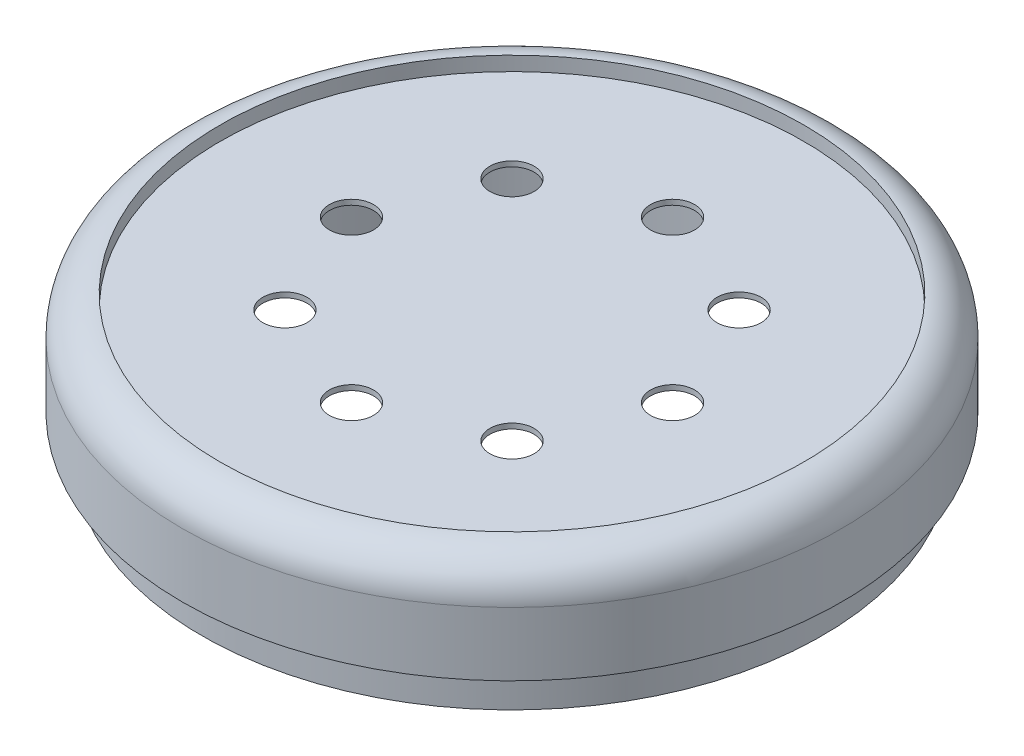
ISO-10303-21;
HEADER;
FILE_DESCRIPTION(('STEP AP214'),'2;1');
FILE_NAME('part.step','',(''),(''),'','','');
FILE_SCHEMA(('AUTOMOTIVE_DESIGN { 1 0 10303 214 1 1 1 1 }'));
ENDSEC;
DATA;
#1=APPLICATION_CONTEXT('core data for automotive mechanical design processes');
#2=APPLICATION_PROTOCOL_DEFINITION('international standard','automotive_design',2000,#1);
#3=PRODUCT_CONTEXT('',#1,'mechanical');
#4=PRODUCT('Part','Part','',(#3));
#5=PRODUCT_RELATED_PRODUCT_CATEGORY('part','',(#4));
#6=PRODUCT_DEFINITION_FORMATION('','',#4);
#7=PRODUCT_DEFINITION_CONTEXT('part definition',#1,'design');
#8=PRODUCT_DEFINITION('design','',#6,#7);
#9=PRODUCT_DEFINITION_SHAPE('','',#8);
#10=(LENGTH_UNIT() NAMED_UNIT(*) SI_UNIT(.MILLI.,.METRE.));
#11=(NAMED_UNIT(*) PLANE_ANGLE_UNIT() SI_UNIT($,.RADIAN.));
#12=(NAMED_UNIT(*) SI_UNIT($,.STERADIAN.) SOLID_ANGLE_UNIT());
#13=UNCERTAINTY_MEASURE_WITH_UNIT(LENGTH_MEASURE(1.E-05),#10,'distance_accuracy_value','');
#14=(GEOMETRIC_REPRESENTATION_CONTEXT(3) GLOBAL_UNCERTAINTY_ASSIGNED_CONTEXT((#13)) GLOBAL_UNIT_ASSIGNED_CONTEXT((#10,
#11,#12)) REPRESENTATION_CONTEXT('',''));
#15=CARTESIAN_POINT('',(0.,0.,0.));
#16=DIRECTION('',(0.,0.,1.));
#17=DIRECTION('',(1.,0.,0.));
#18=AXIS2_PLACEMENT_3D('',#15,#16,#17);
#19=CARTESIAN_POINT('',(-8.75088716452987,0.,-8.7508871645295));
#20=DIRECTION('',(0.,1.,0.));
#21=DIRECTION('',(0.,0.,1.));
#22=AXIS2_PLACEMENT_3D('',#19,#20,#21);
#23=CYLINDRICAL_SURFACE('',#22,1.70000000000057);
#24=CARTESIAN_POINT('',(-8.75088716452987,9.4,-8.7508871645295));
#25=DIRECTION('',(0.,1.,0.));
#26=DIRECTION('',(0.,0.,1.));
#27=AXIS2_PLACEMENT_3D('',#24,#25,#26);
#28=CIRCLE('',#27,1.70000000000057);
#29=CARTESIAN_POINT('',(-8.75088716452987,9.4,-7.05088716452893));
#30=VERTEX_POINT('',#29);
#31=EDGE_CURVE('E84',#30,#30,#28,.T.);
#32=ORIENTED_EDGE('',*,*,#31,.F.);
#33=EDGE_LOOP('',(#32));
#34=FACE_BOUND('',#33,.T.);
#35=CARTESIAN_POINT('',(-8.75088716452987,9.8,-8.7508871645295));
#36=DIRECTION('',(0.,1.,0.));
#37=DIRECTION('',(0.,0.,1.));
#38=AXIS2_PLACEMENT_3D('',#35,#36,#37);
#39=CIRCLE('',#38,1.70000000000057);
#40=CARTESIAN_POINT('',(-8.75088716452987,9.8,-7.05088716452893));
#41=VERTEX_POINT('',#40);
#42=EDGE_CURVE('E81',#41,#41,#39,.F.);
#43=ORIENTED_EDGE('',*,*,#42,.F.);
#44=EDGE_LOOP('',(#43));
#45=FACE_BOUND('',#44,.T.);
#46=ADVANCED_FACE('F34',(#34,#45),#23,.F.);
#47=CARTESIAN_POINT('',(-12.3756233108743,0.,8.78583136030813E-13));
#48=DIRECTION('',(0.,1.,0.));
#49=DIRECTION('',(0.,0.,1.));
#50=AXIS2_PLACEMENT_3D('',#47,#48,#49);
#51=CYLINDRICAL_SURFACE('',#50,1.70000000000122);
#52=CARTESIAN_POINT('',(-12.3756233108743,9.4,8.78583136030813E-13));
#53=DIRECTION('',(0.,1.,0.));
#54=DIRECTION('',(0.,0.,1.));
#55=AXIS2_PLACEMENT_3D('',#52,#53,#54);
#56=CIRCLE('',#55,1.70000000000122);
#57=CARTESIAN_POINT('',(-12.3756233108743,9.4,1.7000000000021));
#58=VERTEX_POINT('',#57);
#59=EDGE_CURVE('E104',#58,#58,#56,.T.);
#60=ORIENTED_EDGE('',*,*,#59,.F.);
#61=EDGE_LOOP('',(#60));
#62=FACE_BOUND('',#61,.T.);
#63=CARTESIAN_POINT('',(-12.3756233108743,9.8,8.78583136030813E-13));
#64=DIRECTION('',(0.,1.,0.));
#65=DIRECTION('',(0.,0.,1.));
#66=AXIS2_PLACEMENT_3D('',#63,#64,#65);
#67=CIRCLE('',#66,1.70000000000122);
#68=CARTESIAN_POINT('',(-12.3756233108743,9.8,1.7000000000021));
#69=VERTEX_POINT('',#68);
#70=EDGE_CURVE('E78',#69,#69,#67,.F.);
#71=ORIENTED_EDGE('',*,*,#70,.F.);
#72=EDGE_LOOP('',(#71));
#73=FACE_BOUND('',#72,.T.);
#74=ADVANCED_FACE('F155',(#62,#73),#51,.F.);
#75=CARTESIAN_POINT('',(-8.75088716452863,0.,8.75088716453075));
#76=DIRECTION('',(0.,1.,0.));
#77=DIRECTION('',(0.,0.,1.));
#78=AXIS2_PLACEMENT_3D('',#75,#76,#77);
#79=CYLINDRICAL_SURFACE('',#78,1.70000000000171);
#80=CARTESIAN_POINT('',(-8.75088716452863,9.4,8.75088716453075));
#81=DIRECTION('',(0.,1.,0.));
#82=DIRECTION('',(0.,0.,1.));
#83=AXIS2_PLACEMENT_3D('',#80,#81,#82);
#84=CIRCLE('',#83,1.70000000000171);
#85=CARTESIAN_POINT('',(-8.75088716452863,9.4,10.4508871645325));
#86=VERTEX_POINT('',#85);
#87=EDGE_CURVE('E107',#86,#86,#84,.T.);
#88=ORIENTED_EDGE('',*,*,#87,.F.);
#89=EDGE_LOOP('',(#88));
#90=FACE_BOUND('',#89,.T.);
#91=CARTESIAN_POINT('',(-8.75088716452863,9.8,8.75088716453075));
#92=DIRECTION('',(0.,1.,0.));
#93=DIRECTION('',(0.,0.,1.));
#94=AXIS2_PLACEMENT_3D('',#91,#92,#93);
#95=CIRCLE('',#94,1.70000000000171);
#96=CARTESIAN_POINT('',(-8.75088716452863,9.8,10.4508871645325));
#97=VERTEX_POINT('',#96);
#98=EDGE_CURVE('E75',#97,#97,#95,.F.);
#99=ORIENTED_EDGE('',*,*,#98,.F.);
#100=EDGE_LOOP('',(#99));
#101=FACE_BOUND('',#100,.T.);
#102=ADVANCED_FACE('F161',(#90,#101),#79,.F.);
#103=CARTESIAN_POINT('',(1.7541351185666E-12,0.,12.3756233108751));
#104=DIRECTION('',(0.,1.,0.));
#105=DIRECTION('',(0.,0.,1.));
#106=AXIS2_PLACEMENT_3D('',#103,#104,#105);
#107=CYLINDRICAL_SURFACE('',#106,1.70000000000176);
#108=CARTESIAN_POINT('',(1.7541351185666E-12,9.4,12.3756233108751));
#109=DIRECTION('',(0.,1.,0.));
#110=DIRECTION('',(0.,0.,1.));
#111=AXIS2_PLACEMENT_3D('',#108,#109,#110);
#112=CIRCLE('',#111,1.70000000000176);
#113=CARTESIAN_POINT('',(1.7541351185666E-12,9.4,14.0756233108769));
#114=VERTEX_POINT('',#113);
#115=EDGE_CURVE('E110',#114,#114,#112,.T.);
#116=ORIENTED_EDGE('',*,*,#115,.F.);
#117=EDGE_LOOP('',(#116));
#118=FACE_BOUND('',#117,.T.);
#119=CARTESIAN_POINT('',(1.7541351185666E-12,9.8,12.3756233108751));
#120=DIRECTION('',(0.,1.,0.));
#121=DIRECTION('',(0.,0.,1.));
#122=AXIS2_PLACEMENT_3D('',#119,#120,#121);
#123=CIRCLE('',#122,1.70000000000176);
#124=CARTESIAN_POINT('',(1.7541351185666E-12,9.8,14.0756233108769));
#125=VERTEX_POINT('',#124);
#126=EDGE_CURVE('E72',#125,#125,#123,.F.);
#127=ORIENTED_EDGE('',*,*,#126,.F.);
#128=EDGE_LOOP('',(#127));
#129=FACE_BOUND('',#128,.T.);
#130=ADVANCED_FACE('F266',(#118,#129),#107,.F.);
#131=CARTESIAN_POINT('',(8.75088716453162,0.,8.75088716452951));
#132=DIRECTION('',(0.,1.,0.));
#133=DIRECTION('',(0.,0.,1.));
#134=AXIS2_PLACEMENT_3D('',#131,#132,#133);
#135=CYLINDRICAL_SURFACE('',#134,1.70000000000131);
#136=CARTESIAN_POINT('',(8.75088716453162,9.4,8.75088716452951));
#137=DIRECTION('',(0.,1.,0.));
#138=DIRECTION('',(0.,0.,1.));
#139=AXIS2_PLACEMENT_3D('',#136,#137,#138);
#140=CIRCLE('',#139,1.70000000000131);
#141=CARTESIAN_POINT('',(8.75088716453162,9.4,10.4508871645308));
#142=VERTEX_POINT('',#141);
#143=EDGE_CURVE('E113',#142,#142,#140,.T.);
#144=ORIENTED_EDGE('',*,*,#143,.F.);
#145=EDGE_LOOP('',(#144));
#146=FACE_BOUND('',#145,.T.);
#147=CARTESIAN_POINT('',(8.75088716453162,9.8,8.75088716452951));
#148=DIRECTION('',(0.,1.,0.));
#149=DIRECTION('',(0.,0.,1.));
#150=AXIS2_PLACEMENT_3D('',#147,#148,#149);
#151=CIRCLE('',#150,1.70000000000131);
#152=CARTESIAN_POINT('',(8.75088716453162,9.8,10.4508871645308));
#153=VERTEX_POINT('',#152);
#154=EDGE_CURVE('E69',#153,#153,#151,.F.);
#155=ORIENTED_EDGE('',*,*,#154,.F.);
#156=EDGE_LOOP('',(#155));
#157=FACE_BOUND('',#156,.T.);
#158=ADVANCED_FACE('F274',(#146,#157),#135,.F.);
#159=CARTESIAN_POINT('',(12.375623310876,0.,-8.77067559283302E-13));
#160=DIRECTION('',(0.,1.,0.));
#161=DIRECTION('',(0.,0.,1.));
#162=AXIS2_PLACEMENT_3D('',#159,#160,#161);
#163=CYLINDRICAL_SURFACE('',#162,1.70000000000062);
#164=CARTESIAN_POINT('',(12.375623310876,9.4,-8.77067559283302E-13));
#165=DIRECTION('',(0.,1.,0.));
#166=DIRECTION('',(0.,0.,1.));
#167=AXIS2_PLACEMENT_3D('',#164,#165,#166);
#168=CIRCLE('',#167,1.70000000000062);
#169=CARTESIAN_POINT('',(12.375623310876,9.4,1.69999999999975));
#170=VERTEX_POINT('',#169);
#171=EDGE_CURVE('E116',#170,#170,#168,.T.);
#172=ORIENTED_EDGE('',*,*,#171,.F.);
#173=EDGE_LOOP('',(#172));
#174=FACE_BOUND('',#173,.T.);
#175=CARTESIAN_POINT('',(12.375623310876,9.8,-8.77067559283302E-13));
#176=DIRECTION('',(0.,1.,0.));
#177=DIRECTION('',(0.,0.,1.));
#178=AXIS2_PLACEMENT_3D('',#175,#176,#177);
#179=CIRCLE('',#178,1.70000000000062);
#180=CARTESIAN_POINT('',(12.375623310876,9.8,1.69999999999975));
#181=VERTEX_POINT('',#180);
#182=EDGE_CURVE('E66',#181,#181,#179,.F.);
#183=ORIENTED_EDGE('',*,*,#182,.F.);
#184=EDGE_LOOP('',(#183));
#185=FACE_BOUND('',#184,.T.);
#186=ADVANCED_FACE('F283',(#174,#185),#163,.F.);
#187=CARTESIAN_POINT('',(8.75088716453038,0.,-8.75088716453074));
#188=DIRECTION('',(0.,1.,0.));
#189=DIRECTION('',(0.,0.,1.));
#190=AXIS2_PLACEMENT_3D('',#187,#188,#189);
#191=CYLINDRICAL_SURFACE('',#190,1.70000000000008);
#192=CARTESIAN_POINT('',(8.75088716453038,9.4,-8.75088716453074));
#193=DIRECTION('',(0.,1.,0.));
#194=DIRECTION('',(0.,0.,1.));
#195=AXIS2_PLACEMENT_3D('',#192,#193,#194);
#196=CIRCLE('',#195,1.70000000000008);
#197=CARTESIAN_POINT('',(8.75088716453038,9.4,-7.05088716453066));
#198=VERTEX_POINT('',#197);
#199=EDGE_CURVE('E118',#198,#198,#196,.T.);
#200=ORIENTED_EDGE('',*,*,#199,.F.);
#201=EDGE_LOOP('',(#200));
#202=FACE_BOUND('',#201,.T.);
#203=CARTESIAN_POINT('',(8.75088716453038,9.8,-8.75088716453074));
#204=DIRECTION('',(0.,1.,0.));
#205=DIRECTION('',(0.,0.,1.));
#206=AXIS2_PLACEMENT_3D('',#203,#204,#205);
#207=CIRCLE('',#206,1.70000000000008);
#208=CARTESIAN_POINT('',(8.75088716453038,9.8,-7.05088716453066));
#209=VERTEX_POINT('',#208);
#210=EDGE_CURVE('E58',#209,#209,#207,.F.);
#211=ORIENTED_EDGE('',*,*,#210,.F.);
#212=EDGE_LOOP('',(#211));
#213=FACE_BOUND('',#212,.T.);
#214=ADVANCED_FACE('F131',(#202,#213),#191,.F.);
#215=CARTESIAN_POINT('',(0.,0.,-12.3756233108751));
#216=DIRECTION('',(0.,1.,0.));
#217=DIRECTION('',(0.,0.,1.));
#218=AXIS2_PLACEMENT_3D('',#215,#216,#217);
#219=CYLINDRICAL_SURFACE('',#218,1.7);
#220=CARTESIAN_POINT('',(0.,9.4,-12.3756233108751));
#221=DIRECTION('',(0.,1.,0.));
#222=DIRECTION('',(0.,0.,1.));
#223=AXIS2_PLACEMENT_3D('',#220,#221,#222);
#224=CIRCLE('',#223,1.7);
#225=CARTESIAN_POINT('',(0.,9.4,-10.6756233108751));
#226=VERTEX_POINT('',#225);
#227=EDGE_CURVE('E50',#226,#226,#224,.T.);
#228=ORIENTED_EDGE('',*,*,#227,.F.);
#229=EDGE_LOOP('',(#228));
#230=FACE_BOUND('',#229,.T.);
#231=CARTESIAN_POINT('',(0.,9.8,-12.3756233108751));
#232=DIRECTION('',(0.,1.,0.));
#233=DIRECTION('',(0.,0.,1.));
#234=AXIS2_PLACEMENT_3D('',#231,#232,#233);
#235=CIRCLE('',#234,1.7);
#236=CARTESIAN_POINT('',(0.,9.8,-10.6756233108751));
#237=VERTEX_POINT('',#236);
#238=EDGE_CURVE('E38',#237,#237,#235,.F.);
#239=ORIENTED_EDGE('',*,*,#238,.F.);
#240=EDGE_LOOP('',(#239));
#241=FACE_BOUND('',#240,.T.);
#242=ADVANCED_FACE('F127',(#230,#241),#219,.F.);
#243=CARTESIAN_POINT('',(0.,10.9,0.));
#244=DIRECTION('',(0.,-1.,0.));
#245=DIRECTION('',(0.,0.,-1.));
#246=AXIS2_PLACEMENT_3D('',#243,#244,#245);
#247=CYLINDRICAL_SURFACE('',#246,25.4);
#248=CARTESIAN_POINT('',(0.,7.9,0.));
#249=DIRECTION('',(0.,1.,0.));
#250=DIRECTION('',(0.,0.,1.));
#251=AXIS2_PLACEMENT_3D('',#248,#249,#250);
#252=CIRCLE('',#251,25.4);
#253=CARTESIAN_POINT('',(0.,7.9,25.4));
#254=VERTEX_POINT('',#253);
#255=EDGE_CURVE('E11',#254,#254,#252,.F.);
#256=ORIENTED_EDGE('',*,*,#255,.T.);
#257=EDGE_LOOP('',(#256));
#258=FACE_BOUND('',#257,.T.);
#259=CARTESIAN_POINT('',(0.,3.,0.));
#260=DIRECTION('',(0.,-1.,0.));
#261=DIRECTION('',(0.,0.,-1.));
#262=AXIS2_PLACEMENT_3D('',#259,#260,#261);
#263=CIRCLE('',#262,25.4);
#264=CARTESIAN_POINT('',(0.,3.,-25.4));
#265=VERTEX_POINT('',#264);
#266=EDGE_CURVE('E42',#265,#265,#263,.T.);
#267=ORIENTED_EDGE('',*,*,#266,.F.);
#268=EDGE_LOOP('',(#267));
#269=FACE_BOUND('',#268,.T.);
#270=ADVANCED_FACE('F130',(#258,#269),#247,.T.);
#271=CARTESIAN_POINT('',(0.,3.,0.));
#272=DIRECTION('',(0.,-1.,0.));
#273=DIRECTION('',(0.,0.,-1.));
#274=AXIS2_PLACEMENT_3D('',#271,#272,#273);
#275=PLANE('',#274);
#276=CARTESIAN_POINT('',(0.,3.,0.));
#277=DIRECTION('',(0.,-1.,0.));
#278=DIRECTION('',(0.,0.,-1.));
#279=AXIS2_PLACEMENT_3D('',#276,#277,#278);
#280=CIRCLE('',#279,23.9);
#281=CARTESIAN_POINT('',(0.,3.,-23.9));
#282=VERTEX_POINT('',#281);
#283=EDGE_CURVE('E47',#282,#282,#280,.T.);
#284=ORIENTED_EDGE('',*,*,#283,.F.);
#285=EDGE_LOOP('',(#284));
#286=FACE_BOUND('',#285,.T.);
#287=ORIENTED_EDGE('',*,*,#266,.T.);
#288=EDGE_LOOP('',(#287));
#289=FACE_BOUND('',#288,.T.);
#290=ADVANCED_FACE('F185',(#286,#289),#275,.T.);
#291=CARTESIAN_POINT('',(0.,3.,0.));
#292=DIRECTION('',(0.,-1.,0.));
#293=DIRECTION('',(0.,0.,-1.));
#294=AXIS2_PLACEMENT_3D('',#291,#292,#293);
#295=CYLINDRICAL_SURFACE('',#294,23.9);
#296=ORIENTED_EDGE('',*,*,#283,.T.);
#297=EDGE_LOOP('',(#296));
#298=FACE_BOUND('',#297,.T.);
#299=CARTESIAN_POINT('',(0.,0.,0.));
#300=DIRECTION('',(0.,-1.,0.));
#301=DIRECTION('',(0.,0.,-1.));
#302=AXIS2_PLACEMENT_3D('',#299,#300,#301);
#303=CIRCLE('',#302,23.9);
#304=CARTESIAN_POINT('',(0.,0.,-23.9));
#305=VERTEX_POINT('',#304);
#306=EDGE_CURVE('E88',#305,#305,#303,.T.);
#307=ORIENTED_EDGE('',*,*,#306,.F.);
#308=EDGE_LOOP('',(#307));
#309=FACE_BOUND('',#308,.T.);
#310=ADVANCED_FACE('F182',(#298,#309),#295,.T.);
#311=CARTESIAN_POINT('',(0.,0.,0.));
#312=DIRECTION('',(0.,1.,0.));
#313=DIRECTION('',(0.,0.,1.));
#314=AXIS2_PLACEMENT_3D('',#311,#312,#313);
#315=PLANE('',#314);
#316=CARTESIAN_POINT('',(0.,0.,0.));
#317=DIRECTION('',(0.,1.,0.));
#318=DIRECTION('',(0.,0.,1.));
#319=AXIS2_PLACEMENT_3D('',#316,#317,#318);
#320=CIRCLE('',#319,22.4);
#321=CARTESIAN_POINT('',(0.,0.,22.4));
#322=VERTEX_POINT('',#321);
#323=EDGE_CURVE('E95',#322,#322,#320,.F.);
#324=ORIENTED_EDGE('',*,*,#323,.F.);
#325=EDGE_LOOP('',(#324));
#326=FACE_BOUND('',#325,.T.);
#327=ORIENTED_EDGE('',*,*,#306,.T.);
#328=EDGE_LOOP('',(#327));
#329=FACE_BOUND('',#328,.T.);
#330=ADVANCED_FACE('F170',(#326,#329),#315,.F.);
#331=CARTESIAN_POINT('',(0.,10.9,0.));
#332=DIRECTION('',(0.,-1.,0.));
#333=DIRECTION('',(0.,0.,-1.));
#334=AXIS2_PLACEMENT_3D('',#331,#332,#333);
#335=CYLINDRICAL_SURFACE('',#334,23.9);
#336=CARTESIAN_POINT('',(0.,9.4,0.));
#337=DIRECTION('',(0.,1.,0.));
#338=DIRECTION('',(0.,0.,1.));
#339=AXIS2_PLACEMENT_3D('',#336,#337,#338);
#340=CIRCLE('',#339,23.9);
#341=CARTESIAN_POINT('',(0.,9.4,23.9));
#342=VERTEX_POINT('',#341);
#343=EDGE_CURVE('E85',#342,#342,#340,.T.);
#344=ORIENTED_EDGE('',*,*,#343,.T.);
#345=EDGE_LOOP('',(#344));
#346=FACE_BOUND('',#345,.T.);
#347=CARTESIAN_POINT('',(0.,4.5,0.));
#348=DIRECTION('',(0.,-1.,0.));
#349=DIRECTION('',(0.,0.,-1.));
#350=AXIS2_PLACEMENT_3D('',#347,#348,#349);
#351=CIRCLE('',#350,23.9);
#352=CARTESIAN_POINT('',(0.,4.5,-23.9));
#353=VERTEX_POINT('',#352);
#354=EDGE_CURVE('E89',#353,#353,#351,.T.);
#355=ORIENTED_EDGE('',*,*,#354,.T.);
#356=EDGE_LOOP('',(#355));
#357=FACE_BOUND('',#356,.T.);
#358=ADVANCED_FACE('F167',(#346,#357),#335,.F.);
#359=CARTESIAN_POINT('',(0.,9.4,0.));
#360=DIRECTION('',(0.,1.,0.));
#361=DIRECTION('',(0.,0.,1.));
#362=AXIS2_PLACEMENT_3D('',#359,#360,#361);
#363=PLANE('',#362);
#364=ORIENTED_EDGE('',*,*,#227,.T.);
#365=EDGE_LOOP('',(#364));
#366=FACE_BOUND('',#365,.T.);
#367=ORIENTED_EDGE('',*,*,#199,.T.);
#368=EDGE_LOOP('',(#367));
#369=FACE_BOUND('',#368,.T.);
#370=ORIENTED_EDGE('',*,*,#171,.T.);
#371=EDGE_LOOP('',(#370));
#372=FACE_BOUND('',#371,.T.);
#373=ORIENTED_EDGE('',*,*,#143,.T.);
#374=EDGE_LOOP('',(#373));
#375=FACE_BOUND('',#374,.T.);
#376=ORIENTED_EDGE('',*,*,#115,.T.);
#377=EDGE_LOOP('',(#376));
#378=FACE_BOUND('',#377,.T.);
#379=ORIENTED_EDGE('',*,*,#87,.T.);
#380=EDGE_LOOP('',(#379));
#381=FACE_BOUND('',#380,.T.);
#382=ORIENTED_EDGE('',*,*,#59,.T.);
#383=EDGE_LOOP('',(#382));
#384=FACE_BOUND('',#383,.T.);
#385=ORIENTED_EDGE('',*,*,#31,.T.);
#386=EDGE_LOOP('',(#385));
#387=FACE_BOUND('',#386,.T.);
#388=ORIENTED_EDGE('',*,*,#343,.F.);
#389=EDGE_LOOP('',(#388));
#390=FACE_BOUND('',#389,.T.);
#391=ADVANCED_FACE('F125',(#366,#369,#372,#375,#378,#381,#384,#387,#390),#363,.F.);
#392=CARTESIAN_POINT('',(0.,4.5,0.));
#393=DIRECTION('',(0.,-1.,0.));
#394=DIRECTION('',(0.,0.,-1.));
#395=AXIS2_PLACEMENT_3D('',#392,#393,#394);
#396=PLANE('',#395);
#397=CARTESIAN_POINT('',(0.,4.5,0.));
#398=DIRECTION('',(0.,-1.,0.));
#399=DIRECTION('',(0.,0.,-1.));
#400=AXIS2_PLACEMENT_3D('',#397,#398,#399);
#401=CIRCLE('',#400,22.4);
#402=CARTESIAN_POINT('',(0.,4.5,-22.4));
#403=VERTEX_POINT('',#402);
#404=EDGE_CURVE('E92',#403,#403,#401,.T.);
#405=ORIENTED_EDGE('',*,*,#404,.T.);
#406=EDGE_LOOP('',(#405));
#407=FACE_BOUND('',#406,.T.);
#408=ORIENTED_EDGE('',*,*,#354,.F.);
#409=EDGE_LOOP('',(#408));
#410=FACE_BOUND('',#409,.T.);
#411=ADVANCED_FACE('F174',(#407,#410),#396,.F.);
#412=CARTESIAN_POINT('',(0.,3.,0.));
#413=DIRECTION('',(0.,-1.,0.));
#414=DIRECTION('',(0.,0.,-1.));
#415=AXIS2_PLACEMENT_3D('',#412,#413,#414);
#416=CYLINDRICAL_SURFACE('',#415,22.4);
#417=ORIENTED_EDGE('',*,*,#404,.F.);
#418=EDGE_LOOP('',(#417));
#419=FACE_BOUND('',#418,.T.);
#420=ORIENTED_EDGE('',*,*,#323,.T.);
#421=EDGE_LOOP('',(#420));
#422=FACE_BOUND('',#421,.T.);
#423=ADVANCED_FACE('F177',(#419,#422),#416,.F.);
#424=CARTESIAN_POINT('',(0.,7.9,0.));
#425=DIRECTION('',(0.,1.,0.));
#426=DIRECTION('',(0.,0.,1.));
#427=AXIS2_PLACEMENT_3D('',#424,#425,#426);
#428=TOROIDAL_SURFACE('',#427,22.4,3.);
#429=CARTESIAN_POINT('',(0.,10.898332870113,0.));
#430=DIRECTION('',(0.,-1.,0.));
#431=DIRECTION('',(0.,0.,-1.));
#432=AXIS2_PLACEMENT_3D('',#429,#430,#431);
#433=CIRCLE('',#432,22.5);
#434=CARTESIAN_POINT('',(0.,10.898332870113,-22.5));
#435=VERTEX_POINT('',#434);
#436=EDGE_CURVE('E52',#435,#435,#433,.F.);
#437=ORIENTED_EDGE('',*,*,#436,.F.);
#438=EDGE_LOOP('',(#437));
#439=FACE_BOUND('',#438,.T.);
#440=ORIENTED_EDGE('',*,*,#255,.F.);
#441=EDGE_LOOP('',(#440));
#442=FACE_BOUND('',#441,.T.);
#443=ADVANCED_FACE('F36',(#439,#442),#428,.T.);
#444=CARTESIAN_POINT('',(0.,9.8,0.));
#445=DIRECTION('',(0.,1.,0.));
#446=DIRECTION('',(0.,0.,1.));
#447=AXIS2_PLACEMENT_3D('',#444,#445,#446);
#448=PLANE('',#447);
#449=CARTESIAN_POINT('',(0.,9.8,0.));
#450=DIRECTION('',(0.,1.,0.));
#451=DIRECTION('',(0.,0.,1.));
#452=AXIS2_PLACEMENT_3D('',#449,#450,#451);
#453=CIRCLE('',#452,22.5);
#454=CARTESIAN_POINT('',(0.,9.8,22.5));
#455=VERTEX_POINT('',#454);
#456=EDGE_CURVE('E54',#455,#455,#453,.T.);
#457=ORIENTED_EDGE('',*,*,#456,.T.);
#458=EDGE_LOOP('',(#457));
#459=FACE_BOUND('',#458,.T.);
#460=ORIENTED_EDGE('',*,*,#238,.T.);
#461=EDGE_LOOP('',(#460));
#462=FACE_BOUND('',#461,.T.);
#463=ORIENTED_EDGE('',*,*,#210,.T.);
#464=EDGE_LOOP('',(#463));
#465=FACE_BOUND('',#464,.T.);
#466=ORIENTED_EDGE('',*,*,#182,.T.);
#467=EDGE_LOOP('',(#466));
#468=FACE_BOUND('',#467,.T.);
#469=ORIENTED_EDGE('',*,*,#154,.T.);
#470=EDGE_LOOP('',(#469));
#471=FACE_BOUND('',#470,.T.);
#472=ORIENTED_EDGE('',*,*,#126,.T.);
#473=EDGE_LOOP('',(#472));
#474=FACE_BOUND('',#473,.T.);
#475=ORIENTED_EDGE('',*,*,#98,.T.);
#476=EDGE_LOOP('',(#475));
#477=FACE_BOUND('',#476,.T.);
#478=ORIENTED_EDGE('',*,*,#70,.T.);
#479=EDGE_LOOP('',(#478));
#480=FACE_BOUND('',#479,.T.);
#481=ORIENTED_EDGE('',*,*,#42,.T.);
#482=EDGE_LOOP('',(#481));
#483=FACE_BOUND('',#482,.T.);
#484=ADVANCED_FACE('F135',(#459,#462,#465,#468,#471,#474,#477,#480,#483),#448,.T.);
#485=CARTESIAN_POINT('',(0.,9.8,0.));
#486=DIRECTION('',(0.,1.,0.));
#487=DIRECTION('',(0.,0.,1.));
#488=AXIS2_PLACEMENT_3D('',#485,#486,#487);
#489=CYLINDRICAL_SURFACE('',#488,22.5);
#490=ORIENTED_EDGE('',*,*,#436,.T.);
#491=EDGE_LOOP('',(#490));
#492=FACE_BOUND('',#491,.T.);
#493=ORIENTED_EDGE('',*,*,#456,.F.);
#494=EDGE_LOOP('',(#493));
#495=FACE_BOUND('',#494,.T.);
#496=ADVANCED_FACE('F138',(#492,#495),#489,.F.);
#497=CLOSED_SHELL('',(#46,#74,#102,#130,#158,#186,#214,#242,#270,#290,#310,#330,#358,#391,#411,
#423,#443,#484,#496));
#498=MANIFOLD_SOLID_BREP('B2',#497);
#499=ADVANCED_BREP_SHAPE_REPRESENTATION('',(#18,#498),#14);
#500=SHAPE_DEFINITION_REPRESENTATION(#9,#499);
ENDSEC;
END-ISO-10303-21;
